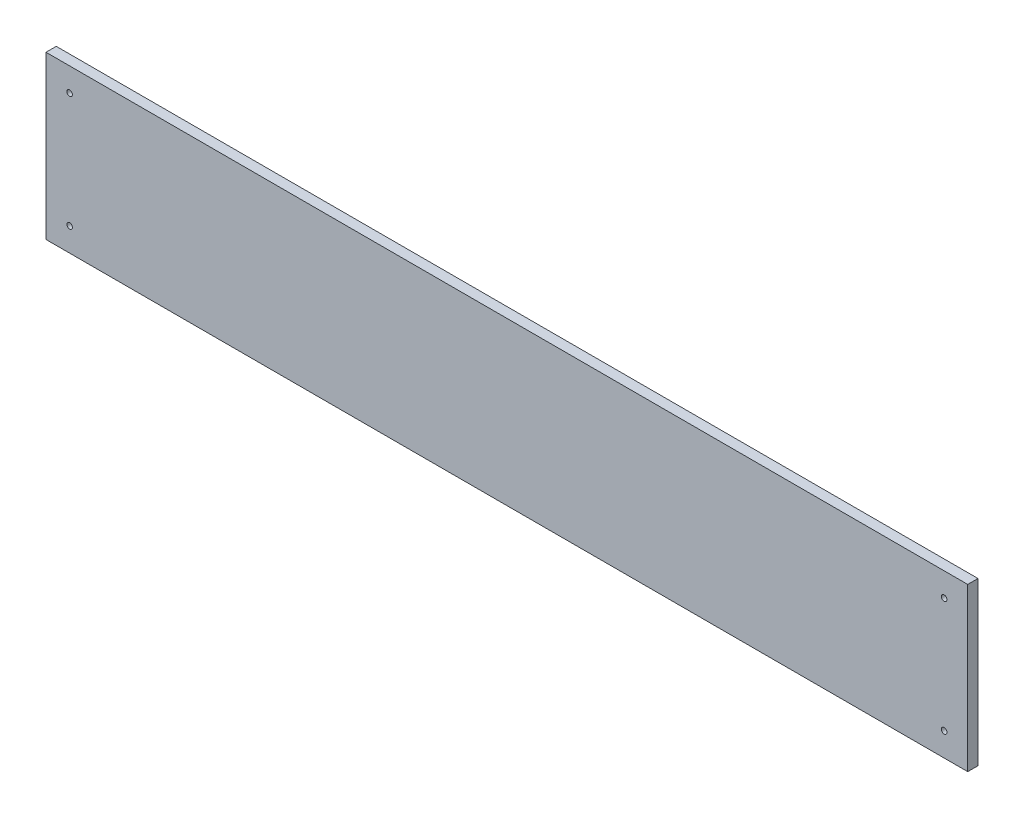
ISO-10303-21;
HEADER;
FILE_DESCRIPTION(('STEP AP214'),'2;1');
FILE_NAME('part.step','',(''),(''),'','','');
FILE_SCHEMA(('AUTOMOTIVE_DESIGN { 1 0 10303 214 1 1 1 1 }'));
ENDSEC;
DATA;
#1=APPLICATION_CONTEXT('core data for automotive mechanical design processes');
#2=APPLICATION_PROTOCOL_DEFINITION('international standard','automotive_design',2000,#1);
#3=PRODUCT_CONTEXT('',#1,'mechanical');
#4=PRODUCT('Part','Part','',(#3));
#5=PRODUCT_RELATED_PRODUCT_CATEGORY('part','',(#4));
#6=PRODUCT_DEFINITION_FORMATION('','',#4);
#7=PRODUCT_DEFINITION_CONTEXT('part definition',#1,'design');
#8=PRODUCT_DEFINITION('design','',#6,#7);
#9=PRODUCT_DEFINITION_SHAPE('','',#8);
#10=(LENGTH_UNIT() NAMED_UNIT(*) SI_UNIT(.MILLI.,.METRE.));
#11=(NAMED_UNIT(*) PLANE_ANGLE_UNIT() SI_UNIT($,.RADIAN.));
#12=(NAMED_UNIT(*) SI_UNIT($,.STERADIAN.) SOLID_ANGLE_UNIT());
#13=UNCERTAINTY_MEASURE_WITH_UNIT(LENGTH_MEASURE(1.E-05),#10,'distance_accuracy_value','');
#14=(GEOMETRIC_REPRESENTATION_CONTEXT(3) GLOBAL_UNCERTAINTY_ASSIGNED_CONTEXT((#13)) GLOBAL_UNIT_ASSIGNED_CONTEXT((#10,
#11,#12)) REPRESENTATION_CONTEXT('',''));
#15=CARTESIAN_POINT('',(0.,0.,0.));
#16=DIRECTION('',(0.,0.,1.));
#17=DIRECTION('',(1.,0.,0.));
#18=AXIS2_PLACEMENT_3D('',#15,#16,#17);
#19=CARTESIAN_POINT('',(0.,0.,5.));
#20=DIRECTION('',(0.,0.,-1.));
#21=DIRECTION('',(-1.,0.,0.));
#22=AXIS2_PLACEMENT_3D('',#19,#20,#21);
#23=PLANE('',#22);
#24=DIRECTION('',(1.,0.,0.));
#25=VECTOR('',#24,1.);
#26=CARTESIAN_POINT('',(449.,0.,5.));
#27=LINE('',#26,#25);
#28=CARTESIAN_POINT('',(0.,0.,5.));
#29=VERTEX_POINT('',#28);
#30=CARTESIAN_POINT('',(449.,0.,5.));
#31=VERTEX_POINT('',#30);
#32=EDGE_CURVE('E91',#29,#31,#27,.T.);
#33=ORIENTED_EDGE('',*,*,#32,.T.);
#34=DIRECTION('',(0.,1.,0.));
#35=VECTOR('',#34,1.);
#36=CARTESIAN_POINT('',(449.,79.,5.));
#37=LINE('',#36,#35);
#38=CARTESIAN_POINT('',(449.,79.,5.));
#39=VERTEX_POINT('',#38);
#40=EDGE_CURVE('E86',#31,#39,#37,.T.);
#41=ORIENTED_EDGE('',*,*,#40,.T.);
#42=DIRECTION('',(-1.,0.,0.));
#43=VECTOR('',#42,1.);
#44=CARTESIAN_POINT('',(0.,79.,5.));
#45=LINE('',#44,#43);
#46=CARTESIAN_POINT('',(0.,79.,5.));
#47=VERTEX_POINT('',#46);
#48=EDGE_CURVE('E89',#39,#47,#45,.T.);
#49=ORIENTED_EDGE('',*,*,#48,.T.);
#50=DIRECTION('',(0.,-1.,0.));
#51=VECTOR('',#50,1.);
#52=CARTESIAN_POINT('',(0.,0.,5.));
#53=LINE('',#52,#51);
#54=EDGE_CURVE('E56',#47,#29,#53,.T.);
#55=ORIENTED_EDGE('',*,*,#54,.T.);
#56=EDGE_LOOP('',(#33,#41,#49,#55));
#57=FACE_BOUND('',#56,.T.);
#58=CARTESIAN_POINT('',(11.5,67.5,5.));
#59=DIRECTION('',(0.,0.,1.));
#60=DIRECTION('',(1.,0.,0.));
#61=AXIS2_PLACEMENT_3D('',#58,#59,#60);
#62=CIRCLE('',#61,1.36166781672217);
#63=CARTESIAN_POINT('',(12.8616678167222,67.5,5.));
#64=VERTEX_POINT('',#63);
#65=EDGE_CURVE('E106',#64,#64,#62,.T.);
#66=ORIENTED_EDGE('',*,*,#65,.F.);
#67=EDGE_LOOP('',(#66));
#68=FACE_BOUND('',#67,.T.);
#69=CARTESIAN_POINT('',(437.5,67.5,5.));
#70=DIRECTION('',(0.,0.,1.));
#71=DIRECTION('',(-1.,0.,0.));
#72=AXIS2_PLACEMENT_3D('',#69,#70,#71);
#73=CIRCLE('',#72,1.36166781672212);
#74=CARTESIAN_POINT('',(436.138332183278,67.5,5.));
#75=VERTEX_POINT('',#74);
#76=EDGE_CURVE('E121',#75,#75,#73,.T.);
#77=ORIENTED_EDGE('',*,*,#76,.F.);
#78=EDGE_LOOP('',(#77));
#79=FACE_BOUND('',#78,.T.);
#80=CARTESIAN_POINT('',(11.5,11.5,5.));
#81=DIRECTION('',(0.,0.,1.));
#82=DIRECTION('',(-1.,0.,0.));
#83=AXIS2_PLACEMENT_3D('',#80,#81,#82);
#84=CIRCLE('',#83,1.36166781672217);
#85=CARTESIAN_POINT('',(10.1383321832778,11.5,5.));
#86=VERTEX_POINT('',#85);
#87=EDGE_CURVE('E127',#86,#86,#84,.T.);
#88=ORIENTED_EDGE('',*,*,#87,.F.);
#89=EDGE_LOOP('',(#88));
#90=FACE_BOUND('',#89,.T.);
#91=CARTESIAN_POINT('',(437.5,11.5,5.));
#92=DIRECTION('',(0.,0.,1.));
#93=DIRECTION('',(1.,0.,0.));
#94=AXIS2_PLACEMENT_3D('',#91,#92,#93);
#95=CIRCLE('',#94,1.36166781672212);
#96=CARTESIAN_POINT('',(438.861667816722,11.5,5.));
#97=VERTEX_POINT('',#96);
#98=EDGE_CURVE('E133',#97,#97,#95,.T.);
#99=ORIENTED_EDGE('',*,*,#98,.F.);
#100=EDGE_LOOP('',(#99));
#101=FACE_BOUND('',#100,.T.);
#102=ADVANCED_FACE('F39',(#57,#68,#79,#90,#101),#23,.F.);
#103=CARTESIAN_POINT('',(0.,0.,0.));
#104=DIRECTION('',(0.,0.,-1.));
#105=DIRECTION('',(-1.,0.,0.));
#106=AXIS2_PLACEMENT_3D('',#103,#104,#105);
#107=PLANE('',#106);
#108=CARTESIAN_POINT('',(11.5,11.5,0.));
#109=DIRECTION('',(0.,0.,1.));
#110=DIRECTION('',(-1.,0.,0.));
#111=AXIS2_PLACEMENT_3D('',#108,#109,#110);
#112=CIRCLE('',#111,1.36166781672217);
#113=CARTESIAN_POINT('',(10.1383321832778,11.5,0.));
#114=VERTEX_POINT('',#113);
#115=EDGE_CURVE('E130',#114,#114,#112,.T.);
#116=ORIENTED_EDGE('',*,*,#115,.T.);
#117=EDGE_LOOP('',(#116));
#118=FACE_BOUND('',#117,.T.);
#119=CARTESIAN_POINT('',(11.5,67.5,0.));
#120=DIRECTION('',(0.,0.,1.));
#121=DIRECTION('',(1.,0.,0.));
#122=AXIS2_PLACEMENT_3D('',#119,#120,#121);
#123=CIRCLE('',#122,1.36166781672217);
#124=CARTESIAN_POINT('',(12.8616678167222,67.5,0.));
#125=VERTEX_POINT('',#124);
#126=EDGE_CURVE('E118',#125,#125,#123,.T.);
#127=ORIENTED_EDGE('',*,*,#126,.T.);
#128=EDGE_LOOP('',(#127));
#129=FACE_BOUND('',#128,.T.);
#130=DIRECTION('',(1.,0.,0.));
#131=VECTOR('',#130,1.);
#132=CARTESIAN_POINT('',(449.,0.,0.));
#133=LINE('',#132,#131);
#134=CARTESIAN_POINT('',(0.,0.,0.));
#135=VERTEX_POINT('',#134);
#136=CARTESIAN_POINT('',(449.,0.,0.));
#137=VERTEX_POINT('',#136);
#138=EDGE_CURVE('E103',#135,#137,#133,.T.);
#139=ORIENTED_EDGE('',*,*,#138,.F.);
#140=DIRECTION('',(0.,-1.,0.));
#141=VECTOR('',#140,1.);
#142=CARTESIAN_POINT('',(0.,0.,0.));
#143=LINE('',#142,#141);
#144=CARTESIAN_POINT('',(0.,79.,0.));
#145=VERTEX_POINT('',#144);
#146=EDGE_CURVE('E79',#145,#135,#143,.T.);
#147=ORIENTED_EDGE('',*,*,#146,.F.);
#148=DIRECTION('',(-1.,0.,0.));
#149=VECTOR('',#148,1.);
#150=CARTESIAN_POINT('',(0.,79.,0.));
#151=LINE('',#150,#149);
#152=CARTESIAN_POINT('',(449.,79.,0.));
#153=VERTEX_POINT('',#152);
#154=EDGE_CURVE('E73',#153,#145,#151,.T.);
#155=ORIENTED_EDGE('',*,*,#154,.F.);
#156=DIRECTION('',(0.,1.,0.));
#157=VECTOR('',#156,1.);
#158=CARTESIAN_POINT('',(449.,79.,0.));
#159=LINE('',#158,#157);
#160=EDGE_CURVE('E95',#137,#153,#159,.T.);
#161=ORIENTED_EDGE('',*,*,#160,.F.);
#162=EDGE_LOOP('',(#139,#147,#155,#161));
#163=FACE_BOUND('',#162,.T.);
#164=CARTESIAN_POINT('',(437.5,67.5,0.));
#165=DIRECTION('',(0.,0.,1.));
#166=DIRECTION('',(-1.,0.,0.));
#167=AXIS2_PLACEMENT_3D('',#164,#165,#166);
#168=CIRCLE('',#167,1.36166781672212);
#169=CARTESIAN_POINT('',(436.138332183278,67.5,0.));
#170=VERTEX_POINT('',#169);
#171=EDGE_CURVE('E124',#170,#170,#168,.T.);
#172=ORIENTED_EDGE('',*,*,#171,.T.);
#173=EDGE_LOOP('',(#172));
#174=FACE_BOUND('',#173,.T.);
#175=CARTESIAN_POINT('',(437.5,11.5,0.));
#176=DIRECTION('',(0.,0.,1.));
#177=DIRECTION('',(1.,0.,0.));
#178=AXIS2_PLACEMENT_3D('',#175,#176,#177);
#179=CIRCLE('',#178,1.36166781672212);
#180=CARTESIAN_POINT('',(438.861667816722,11.5,0.));
#181=VERTEX_POINT('',#180);
#182=EDGE_CURVE('E136',#181,#181,#179,.T.);
#183=ORIENTED_EDGE('',*,*,#182,.T.);
#184=EDGE_LOOP('',(#183));
#185=FACE_BOUND('',#184,.T.);
#186=ADVANCED_FACE('F114',(#118,#129,#163,#174,#185),#107,.T.);
#187=CARTESIAN_POINT('',(449.,0.,5.));
#188=DIRECTION('',(0.,1.,0.));
#189=DIRECTION('',(-1.,0.,0.));
#190=AXIS2_PLACEMENT_3D('',#187,#188,#189);
#191=PLANE('',#190);
#192=ORIENTED_EDGE('',*,*,#138,.T.);
#193=DIRECTION('',(0.,0.,-1.));
#194=VECTOR('',#193,1.);
#195=CARTESIAN_POINT('',(449.,0.,5.));
#196=LINE('',#195,#194);
#197=EDGE_CURVE('E11',#31,#137,#196,.T.);
#198=ORIENTED_EDGE('',*,*,#197,.F.);
#199=ORIENTED_EDGE('',*,*,#32,.F.);
#200=DIRECTION('',(0.,0.,-1.));
#201=VECTOR('',#200,1.);
#202=CARTESIAN_POINT('',(0.,0.,5.));
#203=LINE('',#202,#201);
#204=EDGE_CURVE('E99',#29,#135,#203,.T.);
#205=ORIENTED_EDGE('',*,*,#204,.T.);
#206=EDGE_LOOP('',(#192,#198,#199,#205));
#207=FACE_BOUND('',#206,.T.);
#208=ADVANCED_FACE('F41',(#207),#191,.F.);
#209=CARTESIAN_POINT('',(449.,79.,5.));
#210=DIRECTION('',(-1.,0.,0.));
#211=DIRECTION('',(0.,0.,1.));
#212=AXIS2_PLACEMENT_3D('',#209,#210,#211);
#213=PLANE('',#212);
#214=ORIENTED_EDGE('',*,*,#160,.T.);
#215=DIRECTION('',(0.,0.,-1.));
#216=VECTOR('',#215,1.);
#217=CARTESIAN_POINT('',(449.,79.,5.));
#218=LINE('',#217,#216);
#219=EDGE_CURVE('E48',#39,#153,#218,.T.);
#220=ORIENTED_EDGE('',*,*,#219,.F.);
#221=ORIENTED_EDGE('',*,*,#40,.F.);
#222=ORIENTED_EDGE('',*,*,#197,.T.);
#223=EDGE_LOOP('',(#214,#220,#221,#222));
#224=FACE_BOUND('',#223,.T.);
#225=ADVANCED_FACE('F94',(#224),#213,.F.);
#226=CARTESIAN_POINT('',(0.,79.,5.));
#227=DIRECTION('',(0.,-1.,0.));
#228=DIRECTION('',(0.,0.,-1.));
#229=AXIS2_PLACEMENT_3D('',#226,#227,#228);
#230=PLANE('',#229);
#231=ORIENTED_EDGE('',*,*,#154,.T.);
#232=DIRECTION('',(0.,0.,-1.));
#233=VECTOR('',#232,1.);
#234=CARTESIAN_POINT('',(0.,79.,5.));
#235=LINE('',#234,#233);
#236=EDGE_CURVE('E96',#47,#145,#235,.T.);
#237=ORIENTED_EDGE('',*,*,#236,.F.);
#238=ORIENTED_EDGE('',*,*,#48,.F.);
#239=ORIENTED_EDGE('',*,*,#219,.T.);
#240=EDGE_LOOP('',(#231,#237,#238,#239));
#241=FACE_BOUND('',#240,.T.);
#242=ADVANCED_FACE('F97',(#241),#230,.F.);
#243=CARTESIAN_POINT('',(0.,0.,5.));
#244=DIRECTION('',(1.,0.,0.));
#245=DIRECTION('',(0.,1.,0.));
#246=AXIS2_PLACEMENT_3D('',#243,#244,#245);
#247=PLANE('',#246);
#248=ORIENTED_EDGE('',*,*,#146,.T.);
#249=ORIENTED_EDGE('',*,*,#204,.F.);
#250=ORIENTED_EDGE('',*,*,#54,.F.);
#251=ORIENTED_EDGE('',*,*,#236,.T.);
#252=EDGE_LOOP('',(#248,#249,#250,#251));
#253=FACE_BOUND('',#252,.T.);
#254=ADVANCED_FACE('F111',(#253),#247,.F.);
#255=CARTESIAN_POINT('',(11.5,67.5,5.));
#256=DIRECTION('',(0.,0.,-1.));
#257=DIRECTION('',(-1.,0.,0.));
#258=AXIS2_PLACEMENT_3D('',#255,#256,#257);
#259=CYLINDRICAL_SURFACE('',#258,1.36166781672217);
#260=ORIENTED_EDGE('',*,*,#65,.T.);
#261=EDGE_LOOP('',(#260));
#262=FACE_BOUND('',#261,.T.);
#263=ORIENTED_EDGE('',*,*,#126,.F.);
#264=EDGE_LOOP('',(#263));
#265=FACE_BOUND('',#264,.T.);
#266=ADVANCED_FACE('F153',(#262,#265),#259,.F.);
#267=CARTESIAN_POINT('',(437.5,67.5,5.));
#268=DIRECTION('',(0.,0.,-1.));
#269=DIRECTION('',(-1.,0.,0.));
#270=AXIS2_PLACEMENT_3D('',#267,#268,#269);
#271=CYLINDRICAL_SURFACE('',#270,1.36166781672212);
#272=ORIENTED_EDGE('',*,*,#76,.T.);
#273=EDGE_LOOP('',(#272));
#274=FACE_BOUND('',#273,.T.);
#275=ORIENTED_EDGE('',*,*,#171,.F.);
#276=EDGE_LOOP('',(#275));
#277=FACE_BOUND('',#276,.T.);
#278=ADVANCED_FACE('F201',(#274,#277),#271,.F.);
#279=CARTESIAN_POINT('',(11.5,11.5,5.));
#280=DIRECTION('',(0.,0.,-1.));
#281=DIRECTION('',(-1.,0.,0.));
#282=AXIS2_PLACEMENT_3D('',#279,#280,#281);
#283=CYLINDRICAL_SURFACE('',#282,1.36166781672217);
#284=ORIENTED_EDGE('',*,*,#87,.T.);
#285=EDGE_LOOP('',(#284));
#286=FACE_BOUND('',#285,.T.);
#287=ORIENTED_EDGE('',*,*,#115,.F.);
#288=EDGE_LOOP('',(#287));
#289=FACE_BOUND('',#288,.T.);
#290=ADVANCED_FACE('F209',(#286,#289),#283,.F.);
#291=CARTESIAN_POINT('',(437.5,11.5,5.));
#292=DIRECTION('',(0.,0.,-1.));
#293=DIRECTION('',(-1.,0.,0.));
#294=AXIS2_PLACEMENT_3D('',#291,#292,#293);
#295=CYLINDRICAL_SURFACE('',#294,1.36166781672212);
#296=ORIENTED_EDGE('',*,*,#98,.T.);
#297=EDGE_LOOP('',(#296));
#298=FACE_BOUND('',#297,.T.);
#299=ORIENTED_EDGE('',*,*,#182,.F.);
#300=EDGE_LOOP('',(#299));
#301=FACE_BOUND('',#300,.T.);
#302=ADVANCED_FACE('F142',(#298,#301),#295,.F.);
#303=CLOSED_SHELL('',(#102,#186,#208,#225,#242,#254,#266,#278,#290,#302));
#304=MANIFOLD_SOLID_BREP('B2',#303);
#305=ADVANCED_BREP_SHAPE_REPRESENTATION('',(#18,#304),#14);
#306=SHAPE_DEFINITION_REPRESENTATION(#9,#305);
ENDSEC;
END-ISO-10303-21;
